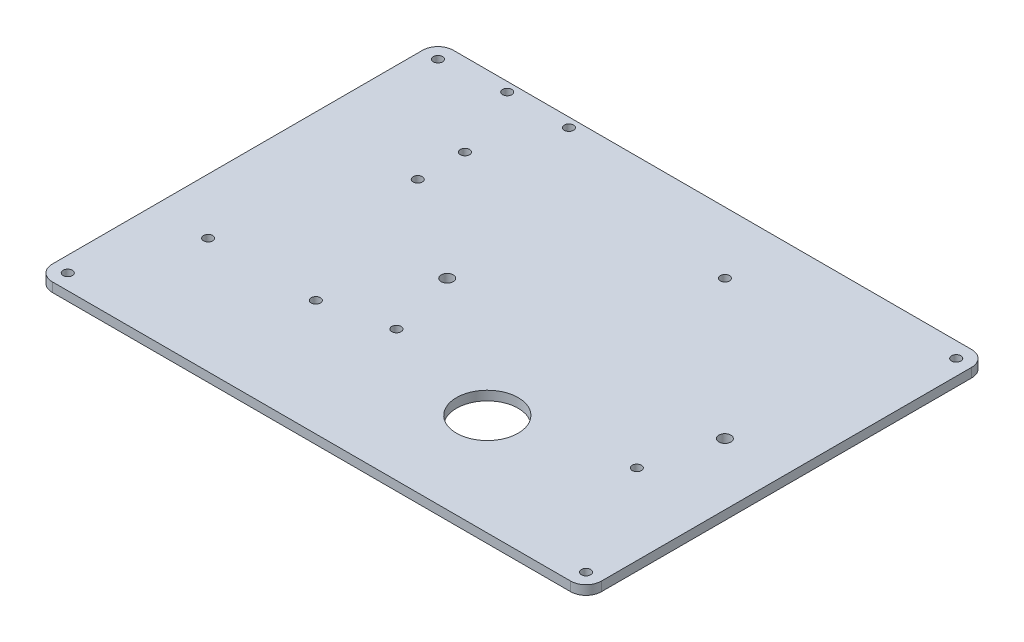
ISO-10303-21;
HEADER;
FILE_DESCRIPTION(('STEP AP214'),'2;1');
FILE_NAME('part.step','',(''),(''),'','','');
FILE_SCHEMA(('AUTOMOTIVE_DESIGN { 1 0 10303 214 1 1 1 1 }'));
ENDSEC;
DATA;
#1=APPLICATION_CONTEXT('core data for automotive mechanical design processes');
#2=APPLICATION_PROTOCOL_DEFINITION('international standard','automotive_design',2000,#1);
#3=PRODUCT_CONTEXT('',#1,'mechanical');
#4=PRODUCT('Part','Part','',(#3));
#5=PRODUCT_RELATED_PRODUCT_CATEGORY('part','',(#4));
#6=PRODUCT_DEFINITION_FORMATION('','',#4);
#7=PRODUCT_DEFINITION_CONTEXT('part definition',#1,'design');
#8=PRODUCT_DEFINITION('design','',#6,#7);
#9=PRODUCT_DEFINITION_SHAPE('','',#8);
#10=(LENGTH_UNIT() NAMED_UNIT(*) SI_UNIT(.MILLI.,.METRE.));
#11=(NAMED_UNIT(*) PLANE_ANGLE_UNIT() SI_UNIT($,.RADIAN.));
#12=(NAMED_UNIT(*) SI_UNIT($,.STERADIAN.) SOLID_ANGLE_UNIT());
#13=UNCERTAINTY_MEASURE_WITH_UNIT(LENGTH_MEASURE(1.E-05),#10,'distance_accuracy_value','');
#14=(GEOMETRIC_REPRESENTATION_CONTEXT(3) GLOBAL_UNCERTAINTY_ASSIGNED_CONTEXT((#13)) GLOBAL_UNIT_ASSIGNED_CONTEXT((#10,
#11,#12)) REPRESENTATION_CONTEXT('',''));
#15=CARTESIAN_POINT('',(0.,0.,0.));
#16=DIRECTION('',(0.,0.,1.));
#17=DIRECTION('',(1.,0.,0.));
#18=AXIS2_PLACEMENT_3D('',#15,#16,#17);
#19=CARTESIAN_POINT('',(-108.,3.,60.));
#20=DIRECTION('',(0.,-1.,0.));
#21=DIRECTION('',(0.,0.,-1.));
#22=AXIS2_PLACEMENT_3D('',#19,#20,#21);
#23=PLANE('',#22);
#24=CARTESIAN_POINT('',(-87.5499999999999,3.,-62.));
#25=DIRECTION('',(0.,1.,0.));
#26=DIRECTION('',(0.,0.,1.));
#27=AXIS2_PLACEMENT_3D('',#24,#25,#26);
#28=CIRCLE('',#27,1.5);
#29=CARTESIAN_POINT('',(-87.5499999999999,3.,-60.5));
#30=VERTEX_POINT('',#29);
#31=EDGE_CURVE('E272',#30,#30,#28,.T.);
#32=ORIENTED_EDGE('',*,*,#31,.F.);
#33=EDGE_LOOP('',(#32));
#34=FACE_BOUND('',#33,.T.);
#35=CARTESIAN_POINT('',(-67.5499999999999,3.,-62.));
#36=DIRECTION('',(0.,1.,0.));
#37=DIRECTION('',(0.,0.,1.));
#38=AXIS2_PLACEMENT_3D('',#35,#36,#37);
#39=CIRCLE('',#38,1.5);
#40=CARTESIAN_POINT('',(-67.5499999999999,3.,-60.5));
#41=VERTEX_POINT('',#40);
#42=EDGE_CURVE('E266',#41,#41,#39,.T.);
#43=ORIENTED_EDGE('',*,*,#42,.F.);
#44=EDGE_LOOP('',(#43));
#45=FACE_BOUND('',#44,.T.);
#46=CARTESIAN_POINT('',(-77.55,3.,-38.3));
#47=DIRECTION('',(0.,1.,0.));
#48=DIRECTION('',(0.,0.,1.));
#49=AXIS2_PLACEMENT_3D('',#46,#47,#48);
#50=CIRCLE('',#49,1.5);
#51=CARTESIAN_POINT('',(-77.55,3.,-36.8));
#52=VERTEX_POINT('',#51);
#53=EDGE_CURVE('E260',#52,#52,#50,.T.);
#54=ORIENTED_EDGE('',*,*,#53,.F.);
#55=EDGE_LOOP('',(#54));
#56=FACE_BOUND('',#55,.T.);
#57=CARTESIAN_POINT('',(-108.,3.,60.));
#58=DIRECTION('',(0.,1.,0.));
#59=DIRECTION('',(0.,0.,-1.));
#60=AXIS2_PLACEMENT_3D('',#57,#58,#59);
#61=CIRCLE('',#60,5.);
#62=CARTESIAN_POINT('',(-113.,3.,60.));
#63=VERTEX_POINT('',#62);
#64=CARTESIAN_POINT('',(-108.,3.,65.));
#65=VERTEX_POINT('',#64);
#66=EDGE_CURVE('E148',#63,#65,#61,.T.);
#67=ORIENTED_EDGE('',*,*,#66,.T.);
#68=DIRECTION('',(1.,0.,0.));
#69=VECTOR('',#68,1.);
#70=CARTESIAN_POINT('',(-108.,3.,65.));
#71=LINE('',#70,#69);
#72=CARTESIAN_POINT('',(60.,3.,65.));
#73=VERTEX_POINT('',#72);
#74=EDGE_CURVE('E96',#65,#73,#71,.T.);
#75=ORIENTED_EDGE('',*,*,#74,.T.);
#76=CARTESIAN_POINT('',(60.,3.,60.));
#77=DIRECTION('',(0.,1.,0.));
#78=DIRECTION('',(0.,0.,1.));
#79=AXIS2_PLACEMENT_3D('',#76,#77,#78);
#80=CIRCLE('',#79,5.);
#81=CARTESIAN_POINT('',(65.,3.,60.));
#82=VERTEX_POINT('',#81);
#83=EDGE_CURVE('E163',#73,#82,#80,.T.);
#84=ORIENTED_EDGE('',*,*,#83,.T.);
#85=DIRECTION('',(0.,0.,-1.));
#86=VECTOR('',#85,1.);
#87=CARTESIAN_POINT('',(65.,3.,60.));
#88=LINE('',#87,#86);
#89=CARTESIAN_POINT('',(65.,3.,-60.));
#90=VERTEX_POINT('',#89);
#91=EDGE_CURVE('E176',#82,#90,#88,.T.);
#92=ORIENTED_EDGE('',*,*,#91,.T.);
#93=CARTESIAN_POINT('',(60.,3.,-60.));
#94=DIRECTION('',(0.,1.,0.));
#95=DIRECTION('',(0.,0.,1.));
#96=AXIS2_PLACEMENT_3D('',#93,#94,#95);
#97=CIRCLE('',#96,4.99999999999999);
#98=CARTESIAN_POINT('',(60.,3.,-65.));
#99=VERTEX_POINT('',#98);
#100=EDGE_CURVE('E115',#90,#99,#97,.T.);
#101=ORIENTED_EDGE('',*,*,#100,.T.);
#102=DIRECTION('',(-1.,0.,0.));
#103=VECTOR('',#102,1.);
#104=CARTESIAN_POINT('',(-108.,3.,-65.));
#105=LINE('',#104,#103);
#106=CARTESIAN_POINT('',(-108.,3.,-65.));
#107=VERTEX_POINT('',#106);
#108=EDGE_CURVE('E109',#99,#107,#105,.T.);
#109=ORIENTED_EDGE('',*,*,#108,.T.);
#110=CARTESIAN_POINT('',(-108.,3.,-60.));
#111=DIRECTION('',(0.,1.,0.));
#112=DIRECTION('',(0.,0.,-1.));
#113=AXIS2_PLACEMENT_3D('',#110,#111,#112);
#114=CIRCLE('',#113,5.00000000000001);
#115=CARTESIAN_POINT('',(-113.,3.,-60.));
#116=VERTEX_POINT('',#115);
#117=EDGE_CURVE('E113',#107,#116,#114,.T.);
#118=ORIENTED_EDGE('',*,*,#117,.T.);
#119=DIRECTION('',(0.,0.,1.));
#120=VECTOR('',#119,1.);
#121=CARTESIAN_POINT('',(-113.,3.,60.));
#122=LINE('',#121,#120);
#123=EDGE_CURVE('E53',#116,#63,#122,.T.);
#124=ORIENTED_EDGE('',*,*,#123,.T.);
#125=EDGE_LOOP('',(#67,#75,#84,#92,#101,#109,#118,#124));
#126=FACE_BOUND('',#125,.T.);
#127=CARTESIAN_POINT('',(0.,3.,-45.));
#128=DIRECTION('',(0.,1.,0.));
#129=DIRECTION('',(0.,0.,1.));
#130=AXIS2_PLACEMENT_3D('',#127,#128,#129);
#131=CIRCLE('',#130,1.5);
#132=CARTESIAN_POINT('',(0.,3.,-43.5));
#133=VERTEX_POINT('',#132);
#134=EDGE_CURVE('E137',#133,#133,#131,.T.);
#135=ORIENTED_EDGE('',*,*,#134,.F.);
#136=EDGE_LOOP('',(#135));
#137=FACE_BOUND('',#136,.T.);
#138=CARTESIAN_POINT('',(-38.9711431702998,3.,22.4999999999999));
#139=DIRECTION('',(0.,1.,0.));
#140=DIRECTION('',(0.,0.,1.));
#141=AXIS2_PLACEMENT_3D('',#138,#139,#140);
#142=CIRCLE('',#141,1.5);
#143=CARTESIAN_POINT('',(-38.9711431702998,3.,23.9999999999999));
#144=VERTEX_POINT('',#143);
#145=EDGE_CURVE('E185',#144,#144,#142,.T.);
#146=ORIENTED_EDGE('',*,*,#145,.F.);
#147=EDGE_LOOP('',(#146));
#148=FACE_BOUND('',#147,.T.);
#149=CARTESIAN_POINT('',(38.9711431702998,3.,22.4999999999999));
#150=DIRECTION('',(0.,1.,0.));
#151=DIRECTION('',(0.,0.,1.));
#152=AXIS2_PLACEMENT_3D('',#149,#150,#151);
#153=CIRCLE('',#152,1.5);
#154=CARTESIAN_POINT('',(38.9711431702998,3.,23.9999999999999));
#155=VERTEX_POINT('',#154);
#156=EDGE_CURVE('E191',#155,#155,#153,.T.);
#157=ORIENTED_EDGE('',*,*,#156,.F.);
#158=EDGE_LOOP('',(#157));
#159=FACE_BOUND('',#158,.T.);
#160=CARTESIAN_POINT('',(-45.,3.,0.));
#161=DIRECTION('',(0.,1.,0.));
#162=DIRECTION('',(0.,0.,1.));
#163=AXIS2_PLACEMENT_3D('',#160,#161,#162);
#164=CIRCLE('',#163,1.95);
#165=CARTESIAN_POINT('',(-45.,3.,1.95));
#166=VERTEX_POINT('',#165);
#167=EDGE_CURVE('E197',#166,#166,#164,.T.);
#168=ORIENTED_EDGE('',*,*,#167,.F.);
#169=EDGE_LOOP('',(#168));
#170=FACE_BOUND('',#169,.T.);
#171=CARTESIAN_POINT('',(45.,3.,0.));
#172=DIRECTION('',(0.,1.,0.));
#173=DIRECTION('',(0.,0.,1.));
#174=AXIS2_PLACEMENT_3D('',#171,#172,#173);
#175=CIRCLE('',#174,1.95);
#176=CARTESIAN_POINT('',(45.,3.,1.95));
#177=VERTEX_POINT('',#176);
#178=EDGE_CURVE('E203',#177,#177,#175,.T.);
#179=ORIENTED_EDGE('',*,*,#178,.F.);
#180=EDGE_LOOP('',(#179));
#181=FACE_BOUND('',#180,.T.);
#182=CARTESIAN_POINT('',(-60.1,3.,27.5));
#183=DIRECTION('',(0.,1.,0.));
#184=DIRECTION('',(0.,0.,-1.));
#185=AXIS2_PLACEMENT_3D('',#182,#183,#184);
#186=CIRCLE('',#185,1.5);
#187=CARTESIAN_POINT('',(-60.1,3.,26.));
#188=VERTEX_POINT('',#187);
#189=EDGE_CURVE('E209',#188,#188,#186,.T.);
#190=ORIENTED_EDGE('',*,*,#189,.F.);
#191=EDGE_LOOP('',(#190));
#192=FACE_BOUND('',#191,.T.);
#193=CARTESIAN_POINT('',(-95.,3.,27.5));
#194=DIRECTION('',(0.,1.,0.));
#195=DIRECTION('',(0.,0.,1.));
#196=AXIS2_PLACEMENT_3D('',#193,#194,#195);
#197=CIRCLE('',#196,1.5);
#198=CARTESIAN_POINT('',(-95.,3.,29.));
#199=VERTEX_POINT('',#198);
#200=EDGE_CURVE('E215',#199,#199,#197,.T.);
#201=ORIENTED_EDGE('',*,*,#200,.F.);
#202=EDGE_LOOP('',(#201));
#203=FACE_BOUND('',#202,.T.);
#204=CARTESIAN_POINT('',(-77.55,3.,-23.));
#205=DIRECTION('',(0.,1.,0.));
#206=DIRECTION('',(0.,0.,1.));
#207=AXIS2_PLACEMENT_3D('',#204,#205,#206);
#208=CIRCLE('',#207,1.5);
#209=CARTESIAN_POINT('',(-77.55,3.,-21.5));
#210=VERTEX_POINT('',#209);
#211=EDGE_CURVE('E221',#210,#210,#208,.T.);
#212=ORIENTED_EDGE('',*,*,#211,.F.);
#213=EDGE_LOOP('',(#212));
#214=FACE_BOUND('',#213,.T.);
#215=CARTESIAN_POINT('',(-108.,3.,-60.));
#216=DIRECTION('',(0.,1.,0.));
#217=DIRECTION('',(0.,0.,1.));
#218=AXIS2_PLACEMENT_3D('',#215,#216,#217);
#219=CIRCLE('',#218,1.5);
#220=CARTESIAN_POINT('',(-108.,3.,-58.5));
#221=VERTEX_POINT('',#220);
#222=EDGE_CURVE('E227',#221,#221,#219,.T.);
#223=ORIENTED_EDGE('',*,*,#222,.F.);
#224=EDGE_LOOP('',(#223));
#225=FACE_BOUND('',#224,.T.);
#226=CARTESIAN_POINT('',(60.,3.,-60.));
#227=DIRECTION('',(0.,1.,0.));
#228=DIRECTION('',(0.,0.,1.));
#229=AXIS2_PLACEMENT_3D('',#226,#227,#228);
#230=CIRCLE('',#229,1.5);
#231=CARTESIAN_POINT('',(60.,3.,-58.5));
#232=VERTEX_POINT('',#231);
#233=EDGE_CURVE('E233',#232,#232,#230,.T.);
#234=ORIENTED_EDGE('',*,*,#233,.F.);
#235=EDGE_LOOP('',(#234));
#236=FACE_BOUND('',#235,.T.);
#237=CARTESIAN_POINT('',(60.,3.,60.));
#238=DIRECTION('',(0.,1.,0.));
#239=DIRECTION('',(0.,0.,1.));
#240=AXIS2_PLACEMENT_3D('',#237,#238,#239);
#241=CIRCLE('',#240,1.5);
#242=CARTESIAN_POINT('',(60.,3.,61.5));
#243=VERTEX_POINT('',#242);
#244=EDGE_CURVE('E239',#243,#243,#241,.T.);
#245=ORIENTED_EDGE('',*,*,#244,.F.);
#246=EDGE_LOOP('',(#245));
#247=FACE_BOUND('',#246,.T.);
#248=CARTESIAN_POINT('',(-108.,3.,60.));
#249=DIRECTION('',(0.,1.,0.));
#250=DIRECTION('',(0.,0.,1.));
#251=AXIS2_PLACEMENT_3D('',#248,#249,#250);
#252=CIRCLE('',#251,1.5);
#253=CARTESIAN_POINT('',(-108.,3.,61.5));
#254=VERTEX_POINT('',#253);
#255=EDGE_CURVE('E245',#254,#254,#252,.T.);
#256=ORIENTED_EDGE('',*,*,#255,.F.);
#257=EDGE_LOOP('',(#256));
#258=FACE_BOUND('',#257,.T.);
#259=CARTESIAN_POINT('',(0.,3.,32.));
#260=DIRECTION('',(0.,1.,0.));
#261=DIRECTION('',(0.,0.,1.));
#262=AXIS2_PLACEMENT_3D('',#259,#260,#261);
#263=CIRCLE('',#262,10.);
#264=CARTESIAN_POINT('',(0.,3.,42.));
#265=VERTEX_POINT('',#264);
#266=EDGE_CURVE('E251',#265,#265,#263,.T.);
#267=ORIENTED_EDGE('',*,*,#266,.F.);
#268=EDGE_LOOP('',(#267));
#269=FACE_BOUND('',#268,.T.);
#270=ADVANCED_FACE('F36',(#34,#45,#56,#126,#137,#148,#159,#170,#181,#192,#203,#214,#225,#236,
#247,#258,#269),#23,.F.);
#271=CARTESIAN_POINT('',(-108.,0.,60.));
#272=DIRECTION('',(0.,-1.,0.));
#273=DIRECTION('',(0.,0.,-1.));
#274=AXIS2_PLACEMENT_3D('',#271,#272,#273);
#275=PLANE('',#274);
#276=CARTESIAN_POINT('',(-87.5499999999999,0.,-62.));
#277=DIRECTION('',(0.,1.,0.));
#278=DIRECTION('',(0.,0.,1.));
#279=AXIS2_PLACEMENT_3D('',#276,#277,#278);
#280=CIRCLE('',#279,1.5);
#281=CARTESIAN_POINT('',(-87.5499999999999,0.,-60.5));
#282=VERTEX_POINT('',#281);
#283=EDGE_CURVE('E257',#282,#282,#280,.T.);
#284=ORIENTED_EDGE('',*,*,#283,.T.);
#285=EDGE_LOOP('',(#284));
#286=FACE_BOUND('',#285,.T.);
#287=CARTESIAN_POINT('',(-67.5499999999999,0.,-62.));
#288=DIRECTION('',(0.,1.,0.));
#289=DIRECTION('',(0.,0.,1.));
#290=AXIS2_PLACEMENT_3D('',#287,#288,#289);
#291=CIRCLE('',#290,1.5);
#292=CARTESIAN_POINT('',(-67.5499999999999,0.,-60.5));
#293=VERTEX_POINT('',#292);
#294=EDGE_CURVE('E269',#293,#293,#291,.T.);
#295=ORIENTED_EDGE('',*,*,#294,.T.);
#296=EDGE_LOOP('',(#295));
#297=FACE_BOUND('',#296,.T.);
#298=CARTESIAN_POINT('',(-77.55,0.,-38.3));
#299=DIRECTION('',(0.,1.,0.));
#300=DIRECTION('',(0.,0.,1.));
#301=AXIS2_PLACEMENT_3D('',#298,#299,#300);
#302=CIRCLE('',#301,1.5);
#303=CARTESIAN_POINT('',(-77.55,0.,-36.8));
#304=VERTEX_POINT('',#303);
#305=EDGE_CURVE('E263',#304,#304,#302,.T.);
#306=ORIENTED_EDGE('',*,*,#305,.T.);
#307=EDGE_LOOP('',(#306));
#308=FACE_BOUND('',#307,.T.);
#309=CARTESIAN_POINT('',(-108.,0.,60.));
#310=DIRECTION('',(0.,1.,0.));
#311=DIRECTION('',(0.,0.,1.));
#312=AXIS2_PLACEMENT_3D('',#309,#310,#311);
#313=CIRCLE('',#312,1.5);
#314=CARTESIAN_POINT('',(-108.,0.,61.5));
#315=VERTEX_POINT('',#314);
#316=EDGE_CURVE('E248',#315,#315,#313,.T.);
#317=ORIENTED_EDGE('',*,*,#316,.T.);
#318=EDGE_LOOP('',(#317));
#319=FACE_BOUND('',#318,.T.);
#320=CARTESIAN_POINT('',(60.,0.,-60.));
#321=DIRECTION('',(0.,1.,0.));
#322=DIRECTION('',(0.,0.,1.));
#323=AXIS2_PLACEMENT_3D('',#320,#321,#322);
#324=CIRCLE('',#323,1.5);
#325=CARTESIAN_POINT('',(60.,0.,-58.5));
#326=VERTEX_POINT('',#325);
#327=EDGE_CURVE('E236',#326,#326,#324,.T.);
#328=ORIENTED_EDGE('',*,*,#327,.T.);
#329=EDGE_LOOP('',(#328));
#330=FACE_BOUND('',#329,.T.);
#331=CARTESIAN_POINT('',(-77.55,0.,-23.));
#332=DIRECTION('',(0.,1.,0.));
#333=DIRECTION('',(0.,0.,1.));
#334=AXIS2_PLACEMENT_3D('',#331,#332,#333);
#335=CIRCLE('',#334,1.5);
#336=CARTESIAN_POINT('',(-77.55,0.,-21.5));
#337=VERTEX_POINT('',#336);
#338=EDGE_CURVE('E224',#337,#337,#335,.T.);
#339=ORIENTED_EDGE('',*,*,#338,.T.);
#340=EDGE_LOOP('',(#339));
#341=FACE_BOUND('',#340,.T.);
#342=CARTESIAN_POINT('',(-60.1,0.,27.5));
#343=DIRECTION('',(0.,1.,0.));
#344=DIRECTION('',(0.,0.,-1.));
#345=AXIS2_PLACEMENT_3D('',#342,#343,#344);
#346=CIRCLE('',#345,1.5);
#347=CARTESIAN_POINT('',(-60.1,0.,26.));
#348=VERTEX_POINT('',#347);
#349=EDGE_CURVE('E212',#348,#348,#346,.T.);
#350=ORIENTED_EDGE('',*,*,#349,.T.);
#351=EDGE_LOOP('',(#350));
#352=FACE_BOUND('',#351,.T.);
#353=CARTESIAN_POINT('',(-45.,0.,0.));
#354=DIRECTION('',(0.,1.,0.));
#355=DIRECTION('',(0.,0.,1.));
#356=AXIS2_PLACEMENT_3D('',#353,#354,#355);
#357=CIRCLE('',#356,1.95);
#358=CARTESIAN_POINT('',(-45.,0.,1.95));
#359=VERTEX_POINT('',#358);
#360=EDGE_CURVE('E200',#359,#359,#357,.T.);
#361=ORIENTED_EDGE('',*,*,#360,.T.);
#362=EDGE_LOOP('',(#361));
#363=FACE_BOUND('',#362,.T.);
#364=CARTESIAN_POINT('',(-38.9711431702998,0.,22.4999999999999));
#365=DIRECTION('',(0.,1.,0.));
#366=DIRECTION('',(0.,0.,1.));
#367=AXIS2_PLACEMENT_3D('',#364,#365,#366);
#368=CIRCLE('',#367,1.5);
#369=CARTESIAN_POINT('',(-38.9711431702998,0.,23.9999999999999));
#370=VERTEX_POINT('',#369);
#371=EDGE_CURVE('E188',#370,#370,#368,.T.);
#372=ORIENTED_EDGE('',*,*,#371,.T.);
#373=EDGE_LOOP('',(#372));
#374=FACE_BOUND('',#373,.T.);
#375=CARTESIAN_POINT('',(-108.,0.,60.));
#376=DIRECTION('',(0.,1.,0.));
#377=DIRECTION('',(0.,0.,-1.));
#378=AXIS2_PLACEMENT_3D('',#375,#376,#377);
#379=CIRCLE('',#378,5.);
#380=CARTESIAN_POINT('',(-113.,0.,60.));
#381=VERTEX_POINT('',#380);
#382=CARTESIAN_POINT('',(-108.,0.,65.));
#383=VERTEX_POINT('',#382);
#384=EDGE_CURVE('E133',#381,#383,#379,.T.);
#385=ORIENTED_EDGE('',*,*,#384,.F.);
#386=DIRECTION('',(0.,0.,1.));
#387=VECTOR('',#386,1.);
#388=CARTESIAN_POINT('',(-113.,0.,60.));
#389=LINE('',#388,#387);
#390=CARTESIAN_POINT('',(-113.,0.,-60.));
#391=VERTEX_POINT('',#390);
#392=EDGE_CURVE('E88',#391,#381,#389,.T.);
#393=ORIENTED_EDGE('',*,*,#392,.F.);
#394=CARTESIAN_POINT('',(-108.,0.,-60.));
#395=DIRECTION('',(0.,1.,0.));
#396=DIRECTION('',(0.,0.,-1.));
#397=AXIS2_PLACEMENT_3D('',#394,#395,#396);
#398=CIRCLE('',#397,5.00000000000001);
#399=CARTESIAN_POINT('',(-108.,0.,-65.));
#400=VERTEX_POINT('',#399);
#401=EDGE_CURVE('E82',#400,#391,#398,.T.);
#402=ORIENTED_EDGE('',*,*,#401,.F.);
#403=DIRECTION('',(-1.,0.,0.));
#404=VECTOR('',#403,1.);
#405=CARTESIAN_POINT('',(-108.,0.,-65.));
#406=LINE('',#405,#404);
#407=CARTESIAN_POINT('',(60.,0.,-65.));
#408=VERTEX_POINT('',#407);
#409=EDGE_CURVE('E123',#408,#400,#406,.T.);
#410=ORIENTED_EDGE('',*,*,#409,.F.);
#411=CARTESIAN_POINT('',(60.,0.,-60.));
#412=DIRECTION('',(0.,1.,0.));
#413=DIRECTION('',(0.,0.,1.));
#414=AXIS2_PLACEMENT_3D('',#411,#412,#413);
#415=CIRCLE('',#414,4.99999999999999);
#416=CARTESIAN_POINT('',(65.,0.,-60.));
#417=VERTEX_POINT('',#416);
#418=EDGE_CURVE('E143',#417,#408,#415,.T.);
#419=ORIENTED_EDGE('',*,*,#418,.F.);
#420=DIRECTION('',(0.,0.,-1.));
#421=VECTOR('',#420,1.);
#422=CARTESIAN_POINT('',(65.,0.,60.));
#423=LINE('',#422,#421);
#424=CARTESIAN_POINT('',(65.,0.,60.));
#425=VERTEX_POINT('',#424);
#426=EDGE_CURVE('E141',#425,#417,#423,.T.);
#427=ORIENTED_EDGE('',*,*,#426,.F.);
#428=CARTESIAN_POINT('',(60.,0.,60.));
#429=DIRECTION('',(0.,1.,0.));
#430=DIRECTION('',(0.,0.,1.));
#431=AXIS2_PLACEMENT_3D('',#428,#429,#430);
#432=CIRCLE('',#431,5.);
#433=CARTESIAN_POINT('',(60.,0.,65.));
#434=VERTEX_POINT('',#433);
#435=EDGE_CURVE('E139',#434,#425,#432,.T.);
#436=ORIENTED_EDGE('',*,*,#435,.F.);
#437=DIRECTION('',(1.,0.,0.));
#438=VECTOR('',#437,1.);
#439=CARTESIAN_POINT('',(-108.,0.,65.));
#440=LINE('',#439,#438);
#441=EDGE_CURVE('E136',#383,#434,#440,.T.);
#442=ORIENTED_EDGE('',*,*,#441,.F.);
#443=EDGE_LOOP('',(#385,#393,#402,#410,#419,#427,#436,#442));
#444=FACE_BOUND('',#443,.T.);
#445=CARTESIAN_POINT('',(0.,0.,-45.));
#446=DIRECTION('',(0.,1.,0.));
#447=DIRECTION('',(0.,0.,1.));
#448=AXIS2_PLACEMENT_3D('',#445,#446,#447);
#449=CIRCLE('',#448,1.5);
#450=CARTESIAN_POINT('',(0.,0.,-43.5));
#451=VERTEX_POINT('',#450);
#452=EDGE_CURVE('E182',#451,#451,#449,.T.);
#453=ORIENTED_EDGE('',*,*,#452,.T.);
#454=EDGE_LOOP('',(#453));
#455=FACE_BOUND('',#454,.T.);
#456=CARTESIAN_POINT('',(38.9711431702998,0.,22.4999999999999));
#457=DIRECTION('',(0.,1.,0.));
#458=DIRECTION('',(0.,0.,1.));
#459=AXIS2_PLACEMENT_3D('',#456,#457,#458);
#460=CIRCLE('',#459,1.5);
#461=CARTESIAN_POINT('',(38.9711431702998,0.,23.9999999999999));
#462=VERTEX_POINT('',#461);
#463=EDGE_CURVE('E194',#462,#462,#460,.T.);
#464=ORIENTED_EDGE('',*,*,#463,.T.);
#465=EDGE_LOOP('',(#464));
#466=FACE_BOUND('',#465,.T.);
#467=CARTESIAN_POINT('',(45.,0.,0.));
#468=DIRECTION('',(0.,1.,0.));
#469=DIRECTION('',(0.,0.,1.));
#470=AXIS2_PLACEMENT_3D('',#467,#468,#469);
#471=CIRCLE('',#470,1.95);
#472=CARTESIAN_POINT('',(45.,0.,1.95));
#473=VERTEX_POINT('',#472);
#474=EDGE_CURVE('E206',#473,#473,#471,.T.);
#475=ORIENTED_EDGE('',*,*,#474,.T.);
#476=EDGE_LOOP('',(#475));
#477=FACE_BOUND('',#476,.T.);
#478=CARTESIAN_POINT('',(-95.,0.,27.5));
#479=DIRECTION('',(0.,1.,0.));
#480=DIRECTION('',(0.,0.,1.));
#481=AXIS2_PLACEMENT_3D('',#478,#479,#480);
#482=CIRCLE('',#481,1.5);
#483=CARTESIAN_POINT('',(-95.,0.,29.));
#484=VERTEX_POINT('',#483);
#485=EDGE_CURVE('E218',#484,#484,#482,.T.);
#486=ORIENTED_EDGE('',*,*,#485,.T.);
#487=EDGE_LOOP('',(#486));
#488=FACE_BOUND('',#487,.T.);
#489=CARTESIAN_POINT('',(-108.,0.,-60.));
#490=DIRECTION('',(0.,1.,0.));
#491=DIRECTION('',(0.,0.,1.));
#492=AXIS2_PLACEMENT_3D('',#489,#490,#491);
#493=CIRCLE('',#492,1.5);
#494=CARTESIAN_POINT('',(-108.,0.,-58.5));
#495=VERTEX_POINT('',#494);
#496=EDGE_CURVE('E230',#495,#495,#493,.T.);
#497=ORIENTED_EDGE('',*,*,#496,.T.);
#498=EDGE_LOOP('',(#497));
#499=FACE_BOUND('',#498,.T.);
#500=CARTESIAN_POINT('',(60.,0.,60.));
#501=DIRECTION('',(0.,1.,0.));
#502=DIRECTION('',(0.,0.,1.));
#503=AXIS2_PLACEMENT_3D('',#500,#501,#502);
#504=CIRCLE('',#503,1.5);
#505=CARTESIAN_POINT('',(60.,0.,61.5));
#506=VERTEX_POINT('',#505);
#507=EDGE_CURVE('E242',#506,#506,#504,.T.);
#508=ORIENTED_EDGE('',*,*,#507,.T.);
#509=EDGE_LOOP('',(#508));
#510=FACE_BOUND('',#509,.T.);
#511=CARTESIAN_POINT('',(0.,0.,32.));
#512=DIRECTION('',(0.,1.,0.));
#513=DIRECTION('',(0.,0.,1.));
#514=AXIS2_PLACEMENT_3D('',#511,#512,#513);
#515=CIRCLE('',#514,10.);
#516=CARTESIAN_POINT('',(0.,0.,42.));
#517=VERTEX_POINT('',#516);
#518=EDGE_CURVE('E254',#517,#517,#515,.T.);
#519=ORIENTED_EDGE('',*,*,#518,.T.);
#520=EDGE_LOOP('',(#519));
#521=FACE_BOUND('',#520,.T.);
#522=ADVANCED_FACE('F167',(#286,#297,#308,#319,#330,#341,#352,#363,#374,#444,#455,#466,#477,
#488,#499,#510,#521),#275,.T.);
#523=CARTESIAN_POINT('',(-108.,3.,60.));
#524=DIRECTION('',(0.,-1.,0.));
#525=DIRECTION('',(0.,0.,-1.));
#526=AXIS2_PLACEMENT_3D('',#523,#524,#525);
#527=CYLINDRICAL_SURFACE('',#526,5.);
#528=ORIENTED_EDGE('',*,*,#384,.T.);
#529=DIRECTION('',(0.,-1.,0.));
#530=VECTOR('',#529,1.);
#531=CARTESIAN_POINT('',(-108.,3.,65.));
#532=LINE('',#531,#530);
#533=EDGE_CURVE('E11',#65,#383,#532,.T.);
#534=ORIENTED_EDGE('',*,*,#533,.F.);
#535=ORIENTED_EDGE('',*,*,#66,.F.);
#536=DIRECTION('',(0.,-1.,0.));
#537=VECTOR('',#536,1.);
#538=CARTESIAN_POINT('',(-113.,3.,60.));
#539=LINE('',#538,#537);
#540=EDGE_CURVE('E129',#63,#381,#539,.T.);
#541=ORIENTED_EDGE('',*,*,#540,.T.);
#542=EDGE_LOOP('',(#528,#534,#535,#541));
#543=FACE_BOUND('',#542,.T.);
#544=ADVANCED_FACE('F38',(#543),#527,.T.);
#545=CARTESIAN_POINT('',(-108.,3.,65.));
#546=DIRECTION('',(0.,0.,-1.));
#547=DIRECTION('',(-1.,0.,0.));
#548=AXIS2_PLACEMENT_3D('',#545,#546,#547);
#549=PLANE('',#548);
#550=ORIENTED_EDGE('',*,*,#441,.T.);
#551=DIRECTION('',(0.,-1.,0.));
#552=VECTOR('',#551,1.);
#553=CARTESIAN_POINT('',(60.,3.,65.));
#554=LINE('',#553,#552);
#555=EDGE_CURVE('E45',#73,#434,#554,.T.);
#556=ORIENTED_EDGE('',*,*,#555,.F.);
#557=ORIENTED_EDGE('',*,*,#74,.F.);
#558=ORIENTED_EDGE('',*,*,#533,.T.);
#559=EDGE_LOOP('',(#550,#556,#557,#558));
#560=FACE_BOUND('',#559,.T.);
#561=ADVANCED_FACE('F371',(#560),#549,.F.);
#562=CARTESIAN_POINT('',(60.,3.,60.));
#563=DIRECTION('',(0.,-1.,0.));
#564=DIRECTION('',(0.,0.,-1.));
#565=AXIS2_PLACEMENT_3D('',#562,#563,#564);
#566=CYLINDRICAL_SURFACE('',#565,5.);
#567=ORIENTED_EDGE('',*,*,#435,.T.);
#568=DIRECTION('',(0.,-1.,0.));
#569=VECTOR('',#568,1.);
#570=CARTESIAN_POINT('',(65.,3.,60.));
#571=LINE('',#570,#569);
#572=EDGE_CURVE('E155',#82,#425,#571,.T.);
#573=ORIENTED_EDGE('',*,*,#572,.F.);
#574=ORIENTED_EDGE('',*,*,#83,.F.);
#575=ORIENTED_EDGE('',*,*,#555,.T.);
#576=EDGE_LOOP('',(#567,#573,#574,#575));
#577=FACE_BOUND('',#576,.T.);
#578=ADVANCED_FACE('F161',(#577),#566,.T.);
#579=CARTESIAN_POINT('',(65.,3.,60.));
#580=DIRECTION('',(-1.,0.,0.));
#581=DIRECTION('',(0.,0.,1.));
#582=AXIS2_PLACEMENT_3D('',#579,#580,#581);
#583=PLANE('',#582);
#584=ORIENTED_EDGE('',*,*,#426,.T.);
#585=DIRECTION('',(0.,-1.,0.));
#586=VECTOR('',#585,1.);
#587=CARTESIAN_POINT('',(65.,3.,-60.));
#588=LINE('',#587,#586);
#589=EDGE_CURVE('E152',#90,#417,#588,.T.);
#590=ORIENTED_EDGE('',*,*,#589,.F.);
#591=ORIENTED_EDGE('',*,*,#91,.F.);
#592=ORIENTED_EDGE('',*,*,#572,.T.);
#593=EDGE_LOOP('',(#584,#590,#591,#592));
#594=FACE_BOUND('',#593,.T.);
#595=ADVANCED_FACE('F172',(#594),#583,.F.);
#596=CARTESIAN_POINT('',(60.,3.,-60.));
#597=DIRECTION('',(0.,-1.,0.));
#598=DIRECTION('',(0.,0.,-1.));
#599=AXIS2_PLACEMENT_3D('',#596,#597,#598);
#600=CYLINDRICAL_SURFACE('',#599,4.99999999999999);
#601=ORIENTED_EDGE('',*,*,#418,.T.);
#602=DIRECTION('',(0.,-1.,0.));
#603=VECTOR('',#602,1.);
#604=CARTESIAN_POINT('',(60.,3.,-65.));
#605=LINE('',#604,#603);
#606=EDGE_CURVE('E124',#99,#408,#605,.T.);
#607=ORIENTED_EDGE('',*,*,#606,.F.);
#608=ORIENTED_EDGE('',*,*,#100,.F.);
#609=ORIENTED_EDGE('',*,*,#589,.T.);
#610=EDGE_LOOP('',(#601,#607,#608,#609));
#611=FACE_BOUND('',#610,.T.);
#612=ADVANCED_FACE('F175',(#611),#600,.T.);
#613=CARTESIAN_POINT('',(-108.,3.,-65.));
#614=DIRECTION('',(0.,0.,1.));
#615=DIRECTION('',(1.,0.,0.));
#616=AXIS2_PLACEMENT_3D('',#613,#614,#615);
#617=PLANE('',#616);
#618=ORIENTED_EDGE('',*,*,#409,.T.);
#619=DIRECTION('',(0.,-1.,0.));
#620=VECTOR('',#619,1.);
#621=CARTESIAN_POINT('',(-108.,3.,-65.));
#622=LINE('',#621,#620);
#623=EDGE_CURVE('E120',#107,#400,#622,.T.);
#624=ORIENTED_EDGE('',*,*,#623,.F.);
#625=ORIENTED_EDGE('',*,*,#108,.F.);
#626=ORIENTED_EDGE('',*,*,#606,.T.);
#627=EDGE_LOOP('',(#618,#624,#625,#626));
#628=FACE_BOUND('',#627,.T.);
#629=ADVANCED_FACE('F121',(#628),#617,.F.);
#630=CARTESIAN_POINT('',(-108.,3.,-60.));
#631=DIRECTION('',(0.,-1.,0.));
#632=DIRECTION('',(0.,0.,-1.));
#633=AXIS2_PLACEMENT_3D('',#630,#631,#632);
#634=CYLINDRICAL_SURFACE('',#633,5.00000000000001);
#635=ORIENTED_EDGE('',*,*,#401,.T.);
#636=DIRECTION('',(0.,-1.,0.));
#637=VECTOR('',#636,1.);
#638=CARTESIAN_POINT('',(-113.,3.,-60.));
#639=LINE('',#638,#637);
#640=EDGE_CURVE('E125',#116,#391,#639,.T.);
#641=ORIENTED_EDGE('',*,*,#640,.F.);
#642=ORIENTED_EDGE('',*,*,#117,.F.);
#643=ORIENTED_EDGE('',*,*,#623,.T.);
#644=EDGE_LOOP('',(#635,#641,#642,#643));
#645=FACE_BOUND('',#644,.T.);
#646=ADVANCED_FACE('F127',(#645),#634,.T.);
#647=CARTESIAN_POINT('',(-113.,3.,60.));
#648=DIRECTION('',(1.,0.,0.));
#649=DIRECTION('',(0.,0.,-1.));
#650=AXIS2_PLACEMENT_3D('',#647,#648,#649);
#651=PLANE('',#650);
#652=ORIENTED_EDGE('',*,*,#392,.T.);
#653=ORIENTED_EDGE('',*,*,#540,.F.);
#654=ORIENTED_EDGE('',*,*,#123,.F.);
#655=ORIENTED_EDGE('',*,*,#640,.T.);
#656=EDGE_LOOP('',(#652,#653,#654,#655));
#657=FACE_BOUND('',#656,.T.);
#658=ADVANCED_FACE('F355',(#657),#651,.F.);
#659=CARTESIAN_POINT('',(0.,3.,-45.));
#660=DIRECTION('',(0.,-1.,0.));
#661=DIRECTION('',(0.,0.,-1.));
#662=AXIS2_PLACEMENT_3D('',#659,#660,#661);
#663=CYLINDRICAL_SURFACE('',#662,1.5);
#664=ORIENTED_EDGE('',*,*,#134,.T.);
#665=EDGE_LOOP('',(#664));
#666=FACE_BOUND('',#665,.T.);
#667=ORIENTED_EDGE('',*,*,#452,.F.);
#668=EDGE_LOOP('',(#667));
#669=FACE_BOUND('',#668,.T.);
#670=ADVANCED_FACE('F352',(#666,#669),#663,.F.);
#671=CARTESIAN_POINT('',(-38.9711431702998,3.,22.4999999999999));
#672=DIRECTION('',(0.,-1.,0.));
#673=DIRECTION('',(0.,0.,-1.));
#674=AXIS2_PLACEMENT_3D('',#671,#672,#673);
#675=CYLINDRICAL_SURFACE('',#674,1.5);
#676=ORIENTED_EDGE('',*,*,#145,.T.);
#677=EDGE_LOOP('',(#676));
#678=FACE_BOUND('',#677,.T.);
#679=ORIENTED_EDGE('',*,*,#371,.F.);
#680=EDGE_LOOP('',(#679));
#681=FACE_BOUND('',#680,.T.);
#682=ADVANCED_FACE('F348',(#678,#681),#675,.F.);
#683=CARTESIAN_POINT('',(38.9711431702998,3.,22.4999999999999));
#684=DIRECTION('',(0.,-1.,0.));
#685=DIRECTION('',(0.,0.,-1.));
#686=AXIS2_PLACEMENT_3D('',#683,#684,#685);
#687=CYLINDRICAL_SURFACE('',#686,1.5);
#688=ORIENTED_EDGE('',*,*,#156,.T.);
#689=EDGE_LOOP('',(#688));
#690=FACE_BOUND('',#689,.T.);
#691=ORIENTED_EDGE('',*,*,#463,.F.);
#692=EDGE_LOOP('',(#691));
#693=FACE_BOUND('',#692,.T.);
#694=ADVANCED_FACE('F344',(#690,#693),#687,.F.);
#695=CARTESIAN_POINT('',(-45.,3.,0.));
#696=DIRECTION('',(0.,-1.,0.));
#697=DIRECTION('',(0.,0.,-1.));
#698=AXIS2_PLACEMENT_3D('',#695,#696,#697);
#699=CYLINDRICAL_SURFACE('',#698,1.95);
#700=ORIENTED_EDGE('',*,*,#167,.T.);
#701=EDGE_LOOP('',(#700));
#702=FACE_BOUND('',#701,.T.);
#703=ORIENTED_EDGE('',*,*,#360,.F.);
#704=EDGE_LOOP('',(#703));
#705=FACE_BOUND('',#704,.T.);
#706=ADVANCED_FACE('F340',(#702,#705),#699,.F.);
#707=CARTESIAN_POINT('',(45.,3.,0.));
#708=DIRECTION('',(0.,-1.,0.));
#709=DIRECTION('',(0.,0.,-1.));
#710=AXIS2_PLACEMENT_3D('',#707,#708,#709);
#711=CYLINDRICAL_SURFACE('',#710,1.95);
#712=ORIENTED_EDGE('',*,*,#178,.T.);
#713=EDGE_LOOP('',(#712));
#714=FACE_BOUND('',#713,.T.);
#715=ORIENTED_EDGE('',*,*,#474,.F.);
#716=EDGE_LOOP('',(#715));
#717=FACE_BOUND('',#716,.T.);
#718=ADVANCED_FACE('F336',(#714,#717),#711,.F.);
#719=CARTESIAN_POINT('',(-60.1,3.,27.5));
#720=DIRECTION('',(0.,-1.,0.));
#721=DIRECTION('',(0.,0.,-1.));
#722=AXIS2_PLACEMENT_3D('',#719,#720,#721);
#723=CYLINDRICAL_SURFACE('',#722,1.5);
#724=ORIENTED_EDGE('',*,*,#189,.T.);
#725=EDGE_LOOP('',(#724));
#726=FACE_BOUND('',#725,.T.);
#727=ORIENTED_EDGE('',*,*,#349,.F.);
#728=EDGE_LOOP('',(#727));
#729=FACE_BOUND('',#728,.T.);
#730=ADVANCED_FACE('F332',(#726,#729),#723,.F.);
#731=CARTESIAN_POINT('',(-95.,3.,27.5));
#732=DIRECTION('',(0.,-1.,0.));
#733=DIRECTION('',(0.,0.,-1.));
#734=AXIS2_PLACEMENT_3D('',#731,#732,#733);
#735=CYLINDRICAL_SURFACE('',#734,1.5);
#736=ORIENTED_EDGE('',*,*,#200,.T.);
#737=EDGE_LOOP('',(#736));
#738=FACE_BOUND('',#737,.T.);
#739=ORIENTED_EDGE('',*,*,#485,.F.);
#740=EDGE_LOOP('',(#739));
#741=FACE_BOUND('',#740,.T.);
#742=ADVANCED_FACE('F328',(#738,#741),#735,.F.);
#743=CARTESIAN_POINT('',(-77.55,3.,-23.));
#744=DIRECTION('',(0.,-1.,0.));
#745=DIRECTION('',(0.,0.,-1.));
#746=AXIS2_PLACEMENT_3D('',#743,#744,#745);
#747=CYLINDRICAL_SURFACE('',#746,1.5);
#748=ORIENTED_EDGE('',*,*,#211,.T.);
#749=EDGE_LOOP('',(#748));
#750=FACE_BOUND('',#749,.T.);
#751=ORIENTED_EDGE('',*,*,#338,.F.);
#752=EDGE_LOOP('',(#751));
#753=FACE_BOUND('',#752,.T.);
#754=ADVANCED_FACE('F324',(#750,#753),#747,.F.);
#755=CARTESIAN_POINT('',(-108.,3.,-60.));
#756=DIRECTION('',(0.,-1.,0.));
#757=DIRECTION('',(0.,0.,-1.));
#758=AXIS2_PLACEMENT_3D('',#755,#756,#757);
#759=CYLINDRICAL_SURFACE('',#758,1.5);
#760=ORIENTED_EDGE('',*,*,#222,.T.);
#761=EDGE_LOOP('',(#760));
#762=FACE_BOUND('',#761,.T.);
#763=ORIENTED_EDGE('',*,*,#496,.F.);
#764=EDGE_LOOP('',(#763));
#765=FACE_BOUND('',#764,.T.);
#766=ADVANCED_FACE('F320',(#762,#765),#759,.F.);
#767=CARTESIAN_POINT('',(60.,3.,-60.));
#768=DIRECTION('',(0.,-1.,0.));
#769=DIRECTION('',(0.,0.,-1.));
#770=AXIS2_PLACEMENT_3D('',#767,#768,#769);
#771=CYLINDRICAL_SURFACE('',#770,1.5);
#772=ORIENTED_EDGE('',*,*,#233,.T.);
#773=EDGE_LOOP('',(#772));
#774=FACE_BOUND('',#773,.T.);
#775=ORIENTED_EDGE('',*,*,#327,.F.);
#776=EDGE_LOOP('',(#775));
#777=FACE_BOUND('',#776,.T.);
#778=ADVANCED_FACE('F316',(#774,#777),#771,.F.);
#779=CARTESIAN_POINT('',(60.,3.,60.));
#780=DIRECTION('',(0.,-1.,0.));
#781=DIRECTION('',(0.,0.,-1.));
#782=AXIS2_PLACEMENT_3D('',#779,#780,#781);
#783=CYLINDRICAL_SURFACE('',#782,1.5);
#784=ORIENTED_EDGE('',*,*,#244,.T.);
#785=EDGE_LOOP('',(#784));
#786=FACE_BOUND('',#785,.T.);
#787=ORIENTED_EDGE('',*,*,#507,.F.);
#788=EDGE_LOOP('',(#787));
#789=FACE_BOUND('',#788,.T.);
#790=ADVANCED_FACE('F312',(#786,#789),#783,.F.);
#791=CARTESIAN_POINT('',(-108.,3.,60.));
#792=DIRECTION('',(0.,-1.,0.));
#793=DIRECTION('',(0.,0.,-1.));
#794=AXIS2_PLACEMENT_3D('',#791,#792,#793);
#795=CYLINDRICAL_SURFACE('',#794,1.5);
#796=ORIENTED_EDGE('',*,*,#255,.T.);
#797=EDGE_LOOP('',(#796));
#798=FACE_BOUND('',#797,.T.);
#799=ORIENTED_EDGE('',*,*,#316,.F.);
#800=EDGE_LOOP('',(#799));
#801=FACE_BOUND('',#800,.T.);
#802=ADVANCED_FACE('F305',(#798,#801),#795,.F.);
#803=CARTESIAN_POINT('',(0.,3.,32.));
#804=DIRECTION('',(0.,-1.,0.));
#805=DIRECTION('',(0.,0.,-1.));
#806=AXIS2_PLACEMENT_3D('',#803,#804,#805);
#807=CYLINDRICAL_SURFACE('',#806,10.);
#808=ORIENTED_EDGE('',*,*,#266,.T.);
#809=EDGE_LOOP('',(#808));
#810=FACE_BOUND('',#809,.T.);
#811=ORIENTED_EDGE('',*,*,#518,.F.);
#812=EDGE_LOOP('',(#811));
#813=FACE_BOUND('',#812,.T.);
#814=ADVANCED_FACE('F296',(#810,#813),#807,.F.);
#815=CARTESIAN_POINT('',(-77.55,0.,-38.3));
#816=DIRECTION('',(0.,1.,0.));
#817=DIRECTION('',(0.,0.,1.));
#818=AXIS2_PLACEMENT_3D('',#815,#816,#817);
#819=CYLINDRICAL_SURFACE('',#818,1.5);
#820=ORIENTED_EDGE('',*,*,#305,.F.);
#821=EDGE_LOOP('',(#820));
#822=FACE_BOUND('',#821,.T.);
#823=ORIENTED_EDGE('',*,*,#53,.T.);
#824=EDGE_LOOP('',(#823));
#825=FACE_BOUND('',#824,.T.);
#826=ADVANCED_FACE('F294',(#822,#825),#819,.F.);
#827=CARTESIAN_POINT('',(-67.5499999999999,0.,-62.));
#828=DIRECTION('',(0.,1.,0.));
#829=DIRECTION('',(0.,0.,1.));
#830=AXIS2_PLACEMENT_3D('',#827,#828,#829);
#831=CYLINDRICAL_SURFACE('',#830,1.5);
#832=ORIENTED_EDGE('',*,*,#294,.F.);
#833=EDGE_LOOP('',(#832));
#834=FACE_BOUND('',#833,.T.);
#835=ORIENTED_EDGE('',*,*,#42,.T.);
#836=EDGE_LOOP('',(#835));
#837=FACE_BOUND('',#836,.T.);
#838=ADVANCED_FACE('F283',(#834,#837),#831,.F.);
#839=CARTESIAN_POINT('',(-87.5499999999999,0.,-62.));
#840=DIRECTION('',(0.,1.,0.));
#841=DIRECTION('',(0.,0.,1.));
#842=AXIS2_PLACEMENT_3D('',#839,#840,#841);
#843=CYLINDRICAL_SURFACE('',#842,1.5);
#844=ORIENTED_EDGE('',*,*,#283,.F.);
#845=EDGE_LOOP('',(#844));
#846=FACE_BOUND('',#845,.T.);
#847=ORIENTED_EDGE('',*,*,#31,.T.);
#848=EDGE_LOOP('',(#847));
#849=FACE_BOUND('',#848,.T.);
#850=ADVANCED_FACE('F280',(#846,#849),#843,.F.);
#851=CLOSED_SHELL('',(#270,#522,#544,#561,#578,#595,#612,#629,#646,#658,#670,#682,#694,#706,
#718,#730,#742,#754,#766,#778,#790,#802,#814,#826,#838,#850));
#852=MANIFOLD_SOLID_BREP('B2',#851);
#853=ADVANCED_BREP_SHAPE_REPRESENTATION('',(#18,#852),#14);
#854=SHAPE_DEFINITION_REPRESENTATION(#9,#853);
ENDSEC;
END-ISO-10303-21;
